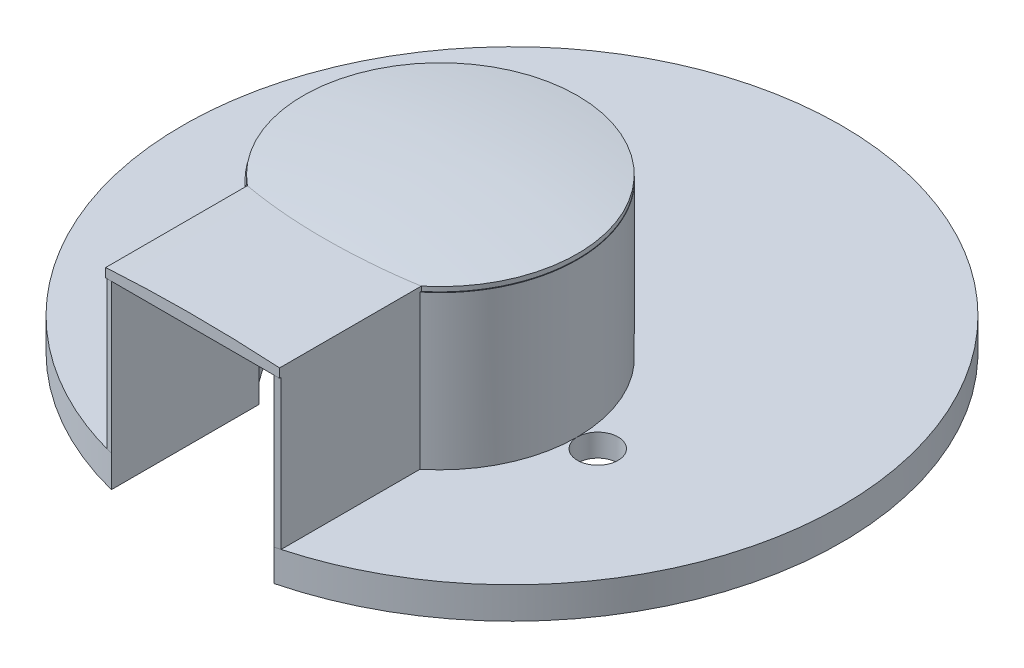
ISO-10303-21;
HEADER;
FILE_DESCRIPTION(('STEP AP214'),'2;1');
FILE_NAME('part.step','',(''),(''),'','','');
FILE_SCHEMA(('AUTOMOTIVE_DESIGN { 1 0 10303 214 1 1 1 1 }'));
ENDSEC;
DATA;
#1=APPLICATION_CONTEXT('core data for automotive mechanical design processes');
#2=APPLICATION_PROTOCOL_DEFINITION('international standard','automotive_design',2000,#1);
#3=PRODUCT_CONTEXT('',#1,'mechanical');
#4=PRODUCT('Part','Part','',(#3));
#5=PRODUCT_RELATED_PRODUCT_CATEGORY('part','',(#4));
#6=PRODUCT_DEFINITION_FORMATION('','',#4);
#7=PRODUCT_DEFINITION_CONTEXT('part definition',#1,'design');
#8=PRODUCT_DEFINITION('design','',#6,#7);
#9=PRODUCT_DEFINITION_SHAPE('','',#8);
#10=(LENGTH_UNIT() NAMED_UNIT(*) SI_UNIT(.MILLI.,.METRE.));
#11=(NAMED_UNIT(*) PLANE_ANGLE_UNIT() SI_UNIT($,.RADIAN.));
#12=(NAMED_UNIT(*) SI_UNIT($,.STERADIAN.) SOLID_ANGLE_UNIT());
#13=UNCERTAINTY_MEASURE_WITH_UNIT(LENGTH_MEASURE(1.E-05),#10,'distance_accuracy_value','');
#14=(GEOMETRIC_REPRESENTATION_CONTEXT(3) GLOBAL_UNCERTAINTY_ASSIGNED_CONTEXT((#13)) GLOBAL_UNIT_ASSIGNED_CONTEXT((#10,
#11,#12)) REPRESENTATION_CONTEXT('',''));
#15=CARTESIAN_POINT('',(0.,0.,0.));
#16=DIRECTION('',(0.,0.,1.));
#17=DIRECTION('',(1.,0.,0.));
#18=AXIS2_PLACEMENT_3D('',#15,#16,#17);
#19=CARTESIAN_POINT('',(0.,20.5,8.));
#20=DIRECTION('',(0.,-1.,0.));
#21=DIRECTION('',(0.,0.,-1.));
#22=AXIS2_PLACEMENT_3D('',#19,#20,#21);
#23=PLANE('',#22);
#24=DIRECTION('',(0.,0.,-1.));
#25=VECTOR('',#24,1.);
#26=CARTESIAN_POINT('',(9.63157894736843,20.5,8.));
#27=LINE('',#26,#25);
#28=CARTESIAN_POINT('',(9.63157894736842,20.5,19.8235014687109));
#29=VERTEX_POINT('',#28);
#30=CARTESIAN_POINT('',(9.63157894736843,20.5,19.6776855724828));
#31=VERTEX_POINT('',#30);
#32=EDGE_CURVE('E287',#29,#31,#27,.T.);
#33=ORIENTED_EDGE('',*,*,#32,.F.);
#34=CARTESIAN_POINT('',(0.,20.5,8.));
#35=DIRECTION('',(0.,1.,0.));
#36=DIRECTION('',(0.,0.,-1.));
#37=AXIS2_PLACEMENT_3D('',#34,#35,#36);
#38=CIRCLE('',#37,15.25);
#39=CARTESIAN_POINT('',(-2.33824036051226E-13,20.5,-7.25));
#40=VERTEX_POINT('',#39);
#41=EDGE_CURVE('E712',#29,#40,#38,.T.);
#42=ORIENTED_EDGE('',*,*,#41,.T.);
#43=CARTESIAN_POINT('',(0.,20.5,7.93636945437416));
#44=DIRECTION('',(0.,1.,0.));
#45=DIRECTION('',(0.,0.,1.));
#46=AXIS2_PLACEMENT_3D('',#43,#44,#45);
#47=CIRCLE('',#46,15.1863694543742);
#48=EDGE_CURVE('E407',#31,#40,#47,.T.);
#49=ORIENTED_EDGE('',*,*,#48,.F.);
#50=EDGE_LOOP('',(#33,#42,#49));
#51=FACE_BOUND('',#50,.T.);
#52=ADVANCED_FACE('F39',(#51),#23,.F.);
#53=CARTESIAN_POINT('',(9.,3.5,19.0481898969922));
#54=DIRECTION('',(1.,0.,0.));
#55=DIRECTION('',(0.,0.,-1.));
#56=AXIS2_PLACEMENT_3D('',#53,#54,#55);
#57=PLANE('',#56);
#58=DIRECTION('',(0.,0.,1.));
#59=VECTOR('',#58,1.);
#60=CARTESIAN_POINT('',(9.,19.9999999155366,19.0481898969922));
#61=LINE('',#60,#59);
#62=CARTESIAN_POINT('',(9.,19.9999999155366,19.673012311648));
#63=VERTEX_POINT('',#62);
#64=CARTESIAN_POINT('',(9.,19.9999999155366,35.373012311648));
#65=VERTEX_POINT('',#64);
#66=EDGE_CURVE('E302',#63,#65,#61,.T.);
#67=ORIENTED_EDGE('',*,*,#66,.F.);
#68=CARTESIAN_POINT('',(9.,20.2999999155366,19.673012311648));
#69=DIRECTION('',(1.,0.,0.));
#70=DIRECTION('',(0.,0.,-1.));
#71=AXIS2_PLACEMENT_3D('',#68,#69,#70);
#72=CIRCLE('',#71,0.3);
#73=CARTESIAN_POINT('',(9.,20.2999999155366,19.373012311648));
#74=VERTEX_POINT('',#73);
#75=EDGE_CURVE('E11',#63,#74,#72,.T.);
#76=ORIENTED_EDGE('',*,*,#75,.T.);
#77=DIRECTION('',(0.,-1.,0.));
#78=VECTOR('',#77,1.);
#79=CARTESIAN_POINT('',(9.,3.5,19.373012311648));
#80=LINE('',#79,#78);
#81=CARTESIAN_POINT('',(9.,20.5,19.373012311648));
#82=VERTEX_POINT('',#81);
#83=EDGE_CURVE('E283',#82,#74,#80,.T.);
#84=ORIENTED_EDGE('',*,*,#83,.F.);
#85=DIRECTION('',(0.,0.,1.));
#86=VECTOR('',#85,1.);
#87=CARTESIAN_POINT('',(9.,20.5,19.0481898969922));
#88=LINE('',#87,#86);
#89=CARTESIAN_POINT('',(9.,20.5,19.0481898969922));
#90=VERTEX_POINT('',#89);
#91=EDGE_CURVE('E700',#90,#82,#88,.T.);
#92=ORIENTED_EDGE('',*,*,#91,.F.);
#93=DIRECTION('',(0.,-1.,0.));
#94=VECTOR('',#93,1.);
#95=CARTESIAN_POINT('',(9.,3.5,19.0481898969922));
#96=LINE('',#95,#94);
#97=CARTESIAN_POINT('',(9.,0.,19.0481898969922));
#98=VERTEX_POINT('',#97);
#99=EDGE_CURVE('E580',#90,#98,#96,.T.);
#100=ORIENTED_EDGE('',*,*,#99,.T.);
#101=DIRECTION('',(0.,0.,1.));
#102=VECTOR('',#101,1.);
#103=CARTESIAN_POINT('',(9.,0.,19.0481898969922));
#104=LINE('',#103,#102);
#105=CARTESIAN_POINT('',(9.,0.,35.373012311648));
#106=VERTEX_POINT('',#105);
#107=EDGE_CURVE('E564',#98,#106,#104,.T.);
#108=ORIENTED_EDGE('',*,*,#107,.T.);
#109=DIRECTION('',(0.,-1.,0.));
#110=VECTOR('',#109,1.);
#111=CARTESIAN_POINT('',(9.,3.5,35.373012311648));
#112=LINE('',#111,#110);
#113=CARTESIAN_POINT('',(9.,3.5,35.373012311648));
#114=VERTEX_POINT('',#113);
#115=EDGE_CURVE('E518',#114,#106,#112,.T.);
#116=ORIENTED_EDGE('',*,*,#115,.F.);
#117=DIRECTION('',(0.,-1.,0.));
#118=VECTOR('',#117,1.);
#119=CARTESIAN_POINT('',(9.,20.5,35.373012311648));
#120=LINE('',#119,#118);
#121=EDGE_CURVE('E608',#65,#114,#120,.T.);
#122=ORIENTED_EDGE('',*,*,#121,.F.);
#123=EDGE_LOOP('',(#67,#76,#84,#92,#100,#108,#116,#122));
#124=FACE_BOUND('',#123,.T.);
#125=ADVANCED_FACE('F373',(#124),#57,.F.);
#126=CARTESIAN_POINT('',(-9.,3.5,19.0481898969922));
#127=DIRECTION('',(-1.,0.,0.));
#128=DIRECTION('',(0.,0.,1.));
#129=AXIS2_PLACEMENT_3D('',#126,#127,#128);
#130=PLANE('',#129);
#131=DIRECTION('',(0.,0.,-1.));
#132=VECTOR('',#131,1.);
#133=CARTESIAN_POINT('',(-9.,19.9999999155366,19.0481898969922));
#134=LINE('',#133,#132);
#135=CARTESIAN_POINT('',(-9.,19.9999999155366,35.373012311648));
#136=VERTEX_POINT('',#135);
#137=CARTESIAN_POINT('',(-9.,19.9999999155366,19.673012311648));
#138=VERTEX_POINT('',#137);
#139=EDGE_CURVE('E295',#136,#138,#134,.T.);
#140=ORIENTED_EDGE('',*,*,#139,.F.);
#141=DIRECTION('',(0.,-1.,0.));
#142=VECTOR('',#141,1.);
#143=CARTESIAN_POINT('',(-9.,20.5,35.373012311648));
#144=LINE('',#143,#142);
#145=CARTESIAN_POINT('',(-8.99999999999999,3.5,35.373012311648));
#146=VERTEX_POINT('',#145);
#147=EDGE_CURVE('E418',#136,#146,#144,.T.);
#148=ORIENTED_EDGE('',*,*,#147,.T.);
#149=DIRECTION('',(0.,-1.,0.));
#150=VECTOR('',#149,1.);
#151=CARTESIAN_POINT('',(-8.99999999999999,3.5,35.373012311648));
#152=LINE('',#151,#150);
#153=CARTESIAN_POINT('',(-8.99999999999999,0.,35.373012311648));
#154=VERTEX_POINT('',#153);
#155=EDGE_CURVE('E579',#146,#154,#152,.T.);
#156=ORIENTED_EDGE('',*,*,#155,.T.);
#157=DIRECTION('',(0.,0.,-1.));
#158=VECTOR('',#157,1.);
#159=CARTESIAN_POINT('',(-9.,0.,19.0481898969922));
#160=LINE('',#159,#158);
#161=CARTESIAN_POINT('',(-9.,0.,19.0481898969922));
#162=VERTEX_POINT('',#161);
#163=EDGE_CURVE('E572',#154,#162,#160,.T.);
#164=ORIENTED_EDGE('',*,*,#163,.T.);
#165=DIRECTION('',(0.,-1.,0.));
#166=VECTOR('',#165,1.);
#167=CARTESIAN_POINT('',(-9.,3.5,19.0481898969922));
#168=LINE('',#167,#166);
#169=CARTESIAN_POINT('',(-9.,20.5,19.0481898969922));
#170=VERTEX_POINT('',#169);
#171=EDGE_CURVE('E575',#170,#162,#168,.T.);
#172=ORIENTED_EDGE('',*,*,#171,.F.);
#173=DIRECTION('',(0.,0.,-1.));
#174=VECTOR('',#173,1.);
#175=CARTESIAN_POINT('',(-9.,20.5,35.373012311648));
#176=LINE('',#175,#174);
#177=CARTESIAN_POINT('',(-9.,20.5,19.373012311648));
#178=VERTEX_POINT('',#177);
#179=EDGE_CURVE('E422',#178,#170,#176,.T.);
#180=ORIENTED_EDGE('',*,*,#179,.F.);
#181=DIRECTION('',(0.,1.,0.));
#182=VECTOR('',#181,1.);
#183=CARTESIAN_POINT('',(-9.,3.5,19.373012311648));
#184=LINE('',#183,#182);
#185=CARTESIAN_POINT('',(-9.,20.2999999155366,19.373012311648));
#186=VERTEX_POINT('',#185);
#187=EDGE_CURVE('E280',#186,#178,#184,.T.);
#188=ORIENTED_EDGE('',*,*,#187,.F.);
#189=CARTESIAN_POINT('',(-9.,20.2999999155366,19.673012311648));
#190=DIRECTION('',(-1.,0.,0.));
#191=DIRECTION('',(0.,0.,1.));
#192=AXIS2_PLACEMENT_3D('',#189,#190,#191);
#193=CIRCLE('',#192,0.3);
#194=EDGE_CURVE('E48',#186,#138,#193,.T.);
#195=ORIENTED_EDGE('',*,*,#194,.T.);
#196=EDGE_LOOP('',(#140,#148,#156,#164,#172,#180,#188,#195));
#197=FACE_BOUND('',#196,.T.);
#198=ADVANCED_FACE('F380',(#197),#130,.F.);
#199=CARTESIAN_POINT('',(9.63157894736843,20.5,35.2062876057759));
#200=DIRECTION('',(-0.255237327404758,0.,-0.966878434292169));
#201=DIRECTION('',(-0.966878434292169,0.,0.255237327404758));
#202=AXIS2_PLACEMENT_3D('',#199,#200,#201);
#203=PLANE('',#202);
#204=DIRECTION('',(0.966878434292169,0.,-0.255237327404758));
#205=VECTOR('',#204,1.);
#206=CARTESIAN_POINT('',(9.63157894736843,19.9999999155366,35.2062876057759));
#207=LINE('',#206,#205);
#208=CARTESIAN_POINT('',(9.63157894736843,19.9999999155366,35.2062876057759));
#209=VERTEX_POINT('',#208);
#210=EDGE_CURVE('E298',#65,#209,#207,.T.);
#211=ORIENTED_EDGE('',*,*,#210,.F.);
#212=ORIENTED_EDGE('',*,*,#121,.T.);
#213=CARTESIAN_POINT('',(9.,3.5,35.373012311648));
#214=DIRECTION('',(0.966878434292169,0.,-0.255237327404758));
#215=VECTOR('',#214,1.);
#216=LINE('',#213,#215);
#217=CARTESIAN_POINT('',(9.63157892148078,3.5,35.2063070725332));
#218=VERTEX_POINT('',#217);
#219=EDGE_CURVE('E432',#114,#218,#216,.T.);
#220=ORIENTED_EDGE('',*,*,#219,.T.);
#221=DIRECTION('',(0.,-1.,0.));
#222=VECTOR('',#221,1.);
#223=CARTESIAN_POINT('',(9.63157894736843,20.5,35.2062876057759));
#224=LINE('',#223,#222);
#225=EDGE_CURVE('E730',#209,#218,#224,.T.);
#226=ORIENTED_EDGE('',*,*,#225,.F.);
#227=EDGE_LOOP('',(#211,#212,#220,#226));
#228=FACE_BOUND('',#227,.T.);
#229=ADVANCED_FACE('F393',(#228),#203,.F.);
#230=CARTESIAN_POINT('',(-9.63157894736842,20.5,35.2062876057759));
#231=DIRECTION('',(0.25523732740476,0.,-0.966878434292169));
#232=DIRECTION('',(-0.966878434292169,0.,-0.25523732740476));
#233=AXIS2_PLACEMENT_3D('',#230,#231,#232);
#234=PLANE('',#233);
#235=DIRECTION('',(0.966878434292169,0.,0.25523732740476));
#236=VECTOR('',#235,1.);
#237=CARTESIAN_POINT('',(-9.63157894736842,19.9999999155366,35.2062876057759));
#238=LINE('',#237,#236);
#239=CARTESIAN_POINT('',(-9.63157894736842,19.9999999155366,35.2062876057759));
#240=VERTEX_POINT('',#239);
#241=EDGE_CURVE('E225',#240,#136,#238,.T.);
#242=ORIENTED_EDGE('',*,*,#241,.F.);
#243=DIRECTION('',(0.,-1.,0.));
#244=VECTOR('',#243,1.);
#245=CARTESIAN_POINT('',(-9.63157894736842,20.5,35.2062876057759));
#246=LINE('',#245,#244);
#247=CARTESIAN_POINT('',(-9.63157892144228,3.5,35.2063083142909));
#248=VERTEX_POINT('',#247);
#249=EDGE_CURVE('E242',#240,#248,#246,.T.);
#250=ORIENTED_EDGE('',*,*,#249,.T.);
#251=CARTESIAN_POINT('',(-9.63157894736842,3.5,35.2062876057759));
#252=DIRECTION('',(0.966878434292169,0.,0.25523732740476));
#253=VECTOR('',#252,1.);
#254=LINE('',#251,#253);
#255=EDGE_CURVE('E706',#248,#146,#254,.T.);
#256=ORIENTED_EDGE('',*,*,#255,.T.);
#257=ORIENTED_EDGE('',*,*,#147,.F.);
#258=EDGE_LOOP('',(#242,#250,#256,#257));
#259=FACE_BOUND('',#258,.T.);
#260=ADVANCED_FACE('F386',(#259),#234,.F.);
#261=DIRECTION('',(0.,0.,1.));
#262=VECTOR('',#261,1.);
#263=CARTESIAN_POINT('',(-9.63157894736843,20.5,8.));
#264=LINE('',#263,#262);
#265=CARTESIAN_POINT('',(-9.63157894736843,20.5,19.6776855724828));
#266=VERTEX_POINT('',#265);
#267=CARTESIAN_POINT('',(-9.63157894736842,20.5,19.8235014687109));
#268=VERTEX_POINT('',#267);
#269=EDGE_CURVE('E291',#266,#268,#264,.T.);
#270=ORIENTED_EDGE('',*,*,#269,.F.);
#271=EDGE_CURVE('E397',#40,#266,#47,.T.);
#272=ORIENTED_EDGE('',*,*,#271,.F.);
#273=EDGE_CURVE('E399',#40,#268,#38,.T.);
#274=ORIENTED_EDGE('',*,*,#273,.T.);
#275=EDGE_LOOP('',(#270,#272,#274));
#276=FACE_BOUND('',#275,.T.);
#277=ADVANCED_FACE('F376',(#276),#23,.F.);
#278=CARTESIAN_POINT('',(0.,20.5,-5.75));
#279=DIRECTION('',(0.,1.,0.));
#280=DIRECTION('',(0.,0.,1.));
#281=AXIS2_PLACEMENT_3D('',#278,#279,#280);
#282=PLANE('',#281);
#283=DIRECTION('',(1.,0.,0.));
#284=VECTOR('',#283,1.);
#285=CARTESIAN_POINT('',(0.,20.5,19.373012311648));
#286=LINE('',#285,#284);
#287=CARTESIAN_POINT('',(-7.51797239931047,20.5,19.373012311648));
#288=VERTEX_POINT('',#287);
#289=EDGE_CURVE('E279',#178,#288,#286,.T.);
#290=ORIENTED_EDGE('',*,*,#289,.F.);
#291=ORIENTED_EDGE('',*,*,#179,.T.);
#292=CARTESIAN_POINT('',(0.,20.5,8.));
#293=DIRECTION('',(0.,-1.,0.));
#294=DIRECTION('',(0.,0.,-1.));
#295=AXIS2_PLACEMENT_3D('',#292,#293,#294);
#296=CIRCLE('',#295,14.25);
#297=EDGE_CURVE('E698',#170,#90,#296,.T.);
#298=ORIENTED_EDGE('',*,*,#297,.T.);
#299=ORIENTED_EDGE('',*,*,#91,.T.);
#300=CARTESIAN_POINT('',(7.51797239931047,20.5,19.373012311648));
#301=VERTEX_POINT('',#300);
#302=EDGE_CURVE('E244',#301,#82,#286,.T.);
#303=ORIENTED_EDGE('',*,*,#302,.F.);
#304=CARTESIAN_POINT('',(0.,20.5,7.93636945437416));
#305=DIRECTION('',(0.,1.,0.));
#306=DIRECTION('',(0.,0.,1.));
#307=AXIS2_PLACEMENT_3D('',#304,#305,#306);
#308=CIRCLE('',#307,13.6863694543742);
#309=EDGE_CURVE('E305',#301,#288,#308,.T.);
#310=ORIENTED_EDGE('',*,*,#309,.T.);
#311=EDGE_LOOP('',(#290,#291,#298,#299,#303,#310));
#312=FACE_BOUND('',#311,.T.);
#313=ADVANCED_FACE('F385',(#312),#282,.F.);
#314=CARTESIAN_POINT('',(0.,22.1,7.93636945437416));
#315=DIRECTION('',(0.,1.,0.));
#316=DIRECTION('',(0.,0.,1.));
#317=AXIS2_PLACEMENT_3D('',#314,#315,#316);
#318=CYLINDRICAL_SURFACE('',#317,15.1863694543742);
#319=DIRECTION('',(0.,1.,0.));
#320=VECTOR('',#319,1.);
#321=CARTESIAN_POINT('',(-9.63157894736843,22.1,19.6776855724828));
#322=LINE('',#321,#320);
#323=CARTESIAN_POINT('',(-9.63157933387925,21.,19.6776852554221));
#324=VERTEX_POINT('',#323);
#325=EDGE_CURVE('E404',#324,#266,#322,.F.);
#326=ORIENTED_EDGE('',*,*,#325,.F.);
#327=CARTESIAN_POINT('',(0.,21.,7.93636945437416));
#328=DIRECTION('',(0.,1.,0.));
#329=DIRECTION('',(0.,0.,1.));
#330=AXIS2_PLACEMENT_3D('',#327,#328,#329);
#331=CIRCLE('',#330,15.1863694543742);
#332=CARTESIAN_POINT('',(9.63157759150874,21.,19.6776866847149));
#333=VERTEX_POINT('',#332);
#334=EDGE_CURVE('E756',#333,#324,#331,.T.);
#335=ORIENTED_EDGE('',*,*,#334,.F.);
#336=DIRECTION('',(0.,1.,0.));
#337=VECTOR('',#336,1.);
#338=CARTESIAN_POINT('',(9.63157894736843,22.1,19.6776855724828));
#339=LINE('',#338,#337);
#340=EDGE_CURVE('E340',#31,#333,#339,.T.);
#341=ORIENTED_EDGE('',*,*,#340,.F.);
#342=ORIENTED_EDGE('',*,*,#48,.T.);
#343=ORIENTED_EDGE('',*,*,#271,.T.);
#344=EDGE_LOOP('',(#326,#335,#341,#342,#343));
#345=FACE_BOUND('',#344,.T.);
#346=ADVANCED_FACE('F324',(#345),#318,.T.);
#347=CARTESIAN_POINT('',(0.,21.,-7.25));
#348=CARTESIAN_POINT('',(0.,22.0473961274008,0.307195453859962));
#349=CARTESIAN_POINT('',(0.,22.1,7.93636945437416));
#350=B_SPLINE_CURVE_WITH_KNOTS('',2,(#347,#348,#349),.UNSPECIFIED.,.F.,.F.,(3,3),(0.,1.),.UNSPECIFIED.);
#351=CARTESIAN_POINT('',(0.,22.1,7.93636945437416));
#352=DIRECTION('',(0.,1.,0.));
#353=AXIS1_PLACEMENT('',#351,#352);
#354=SURFACE_OF_REVOLUTION('',#350,#353);
#355=CARTESIAN_POINT('',(0.,22.1,7.93636945437416));
#356=VERTEX_POINT('',#355);
#357=VERTEX_LOOP('',#356);
#358=FACE_BOUND('',#357,.T.);
#359=CARTESIAN_POINT('',(9.63157759150874,21.,19.6776866847149));
#360=CARTESIAN_POINT('',(9.27344960705985,21.0223106925979,19.7632542832872));
#361=CARTESIAN_POINT('',(8.91402306394495,21.0434556213014,19.8435664016353));
#362=CARTESIAN_POINT('',(8.19273879852531,21.0833581775395,19.9939776243259));
#363=CARTESIAN_POINT('',(7.83088006598716,21.1021147390688,20.0640721702429));
#364=CARTESIAN_POINT('',(6.73771260189378,21.1549155363178,20.2602080076721));
#365=CARTESIAN_POINT('',(6.00343446265745,21.1852015802909,20.3710050981187));
#366=CARTESIAN_POINT('',(4.52954550173994,21.2354079747097,20.553458280065));
#367=CARTESIAN_POINT('',(3.7899332979209,21.2553255329535,20.625103828431));
#368=CARTESIAN_POINT('',(2.30700682515177,21.2845679423428,20.7299852102351));
#369=CARTESIAN_POINT('',(1.56368948465843,21.2938816501898,20.7631806381205));
#370=CARTESIAN_POINT('',(0.076304546111601,21.3017692538154,20.7913084581849));
#371=CARTESIAN_POINT('',(-0.667762991326655,21.3003439570803,20.7862437272184));
#372=CARTESIAN_POINT('',(-1.87296654457538,21.2893457861479,20.7469842886641));
#373=CARTESIAN_POINT('',(-2.33455014743468,21.2830624484648,20.724546175457));
#374=CARTESIAN_POINT('',(-3.25668342743961,21.2663885640686,20.6648041070752));
#375=CARTESIAN_POINT('',(-3.717233126135,21.2559981037752,20.6275004646921));
#376=CARTESIAN_POINT('',(-4.63673506965388,21.2311569372631,20.5378942183939));
#377=CARTESIAN_POINT('',(-5.09568740088779,21.2167064542413,20.4855924389879));
#378=CARTESIAN_POINT('',(-6.01076464687488,21.1838375915503,20.3658623621259));
#379=CARTESIAN_POINT('',(-6.46689279993188,21.1654252792563,20.2984571884292));
#380=CARTESIAN_POINT('',(-7.37644642863493,21.1247058505377,20.1481690826863));
#381=CARTESIAN_POINT('',(-7.82987178141173,21.102398558423,20.0652854524441));
#382=CARTESIAN_POINT('',(-8.73340803592613,21.054004176548,19.8835649395086));
#383=CARTESIAN_POINT('',(-9.18351821454948,21.0279162863958,19.7847246781245));
#384=CARTESIAN_POINT('',(-9.63157894736843,21.0000000844634,19.6776847842486));
#385=B_SPLINE_CURVE_WITH_KNOTS('',3,(#359,#360,#361,#362,#363,#364,#365,#366,#367,#368,#369,
#370,#371,#372,#373,#374,#375,#376,#377,#378,#379,#380,#381,#382,#383,#384),.UNSPECIFIED.,.F.,
.F.,(4,2,2,2,2,2,2,2,2,2,2,2,4),(0.,1.10655730957774,2.21360679298627,4.44196109673573,
6.67091517952816,8.90220945385566,11.1333359545666,12.5196214475661,13.9058777727162,
15.2920579042998,16.6761300795612,18.0602647020671,19.4446927894868),.UNSPECIFIED.);
#386=EDGE_CURVE('E330',#333,#324,#385,.T.);
#387=ORIENTED_EDGE('',*,*,#386,.F.);
#388=ORIENTED_EDGE('',*,*,#334,.T.);
#389=EDGE_LOOP('',(#387,#388));
#390=FACE_BOUND('',#389,.T.);
#391=ADVANCED_FACE('F318',(#358,#390),#354,.T.);
#392=CARTESIAN_POINT('',(0.,21.1,7.93636945437416));
#393=CARTESIAN_POINT('',(0.,20.9674223600963,1.08562125942859));
#394=CARTESIAN_POINT('',(0.,20.5,-5.75));
#395=B_SPLINE_CURVE_WITH_KNOTS('',2,(#392,#393,#394),.UNSPECIFIED.,.F.,.F.,(3,3),(0.,1.),.UNSPECIFIED.);
#396=CARTESIAN_POINT('',(0.,22.1,7.93636945437416));
#397=DIRECTION('',(0.,1.,0.));
#398=AXIS1_PLACEMENT('',#396,#397);
#399=SURFACE_OF_REVOLUTION('',#395,#398);
#400=CARTESIAN_POINT('',(0.,21.1,7.93636945437416));
#401=VERTEX_POINT('',#400);
#402=VERTEX_LOOP('',#401);
#403=FACE_BOUND('',#402,.T.);
#404=CARTESIAN_POINT('',(-7.51797239931047,20.5,19.373012311648));
#405=CARTESIAN_POINT('',(-7.06152326678267,20.5171435586207,19.373012311648));
#406=CARTESIAN_POINT('',(-6.6050214600238,20.5328624620459,19.373012311648));
#407=CARTESIAN_POINT('',(-5.69189659257654,20.5613396151681,19.373012311648));
#408=CARTESIAN_POINT('',(-5.23527352602602,20.5740976766483,19.373012311648));
#409=CARTESIAN_POINT('',(-3.86486043173128,20.6077710016688,19.373012311648));
#410=CARTESIAN_POINT('',(-2.95095154627894,20.6240692323794,19.373012311648));
#411=CARTESIAN_POINT('',(-1.12298212946405,20.6435986360304,19.373012311648));
#412=CARTESIAN_POINT('',(-0.208921596265791,20.6468296371773,19.373012311648));
#413=CARTESIAN_POINT('',(1.61913570457079,20.6400397610865,19.373012311648));
#414=CARTESIAN_POINT('',(2.53313247293999,20.6300190754496,19.373012311648));
#415=CARTESIAN_POINT('',(4.36088550040464,20.5972588371446,19.373012311648));
#416=CARTESIAN_POINT('',(5.27464176271541,20.5745194641606,19.373012311648));
#417=CARTESIAN_POINT('',(6.40985803381559,20.538903779446,19.373012311648));
#418=CARTESIAN_POINT('',(6.631502061274,20.5316010430336,19.373012311648));
#419=CARTESIAN_POINT('',(7.0747588942984,20.5163109362466,19.373012311648));
#420=CARTESIAN_POINT('',(7.29637170067461,20.5083235893663,19.373012311648));
#421=CARTESIAN_POINT('',(7.51797239931047,20.5,19.373012311648));
#422=B_SPLINE_CURVE_WITH_KNOTS('',3,(#404,#405,#406,#407,#408,#409,#410,#411,#412,#413,#414,
#415,#416,#417,#418,#419,#420,#421),.UNSPECIFIED.,.F.,.F.,(4,2,2,2,2,2,2,2,4),(0.,
1.37030858164689,2.74070424817158,5.48277151388823,8.22487482912706,10.9669384978314,
13.7089634288557,14.3742558271635,15.0395254034363),.UNSPECIFIED.);
#423=EDGE_CURVE('E341',#288,#301,#422,.T.);
#424=ORIENTED_EDGE('',*,*,#423,.F.);
#425=ORIENTED_EDGE('',*,*,#309,.F.);
#426=EDGE_LOOP('',(#424,#425));
#427=FACE_BOUND('',#426,.T.);
#428=ADVANCED_FACE('F323',(#403,#427),#399,.T.);
#429=CARTESIAN_POINT('',(0.,3.5,8.));
#430=DIRECTION('',(0.,-1.,0.));
#431=DIRECTION('',(0.,0.,-1.));
#432=AXIS2_PLACEMENT_3D('',#429,#430,#431);
#433=CYLINDRICAL_SURFACE('',#432,14.25);
#434=DIRECTION('',(0.,-1.,0.));
#435=VECTOR('',#434,1.);
#436=CARTESIAN_POINT('',(-13.7477270848675,3.5,4.25));
#437=LINE('',#436,#435);
#438=CARTESIAN_POINT('',(-13.7477270848675,0.,4.25));
#439=VERTEX_POINT('',#438);
#440=CARTESIAN_POINT('',(-13.7477270848675,1.,4.25));
#441=VERTEX_POINT('',#440);
#442=EDGE_CURVE('E541',#439,#441,#437,.F.);
#443=ORIENTED_EDGE('',*,*,#442,.F.);
#444=CARTESIAN_POINT('',(0.,0.,8.));
#445=DIRECTION('',(0.,-1.,0.));
#446=DIRECTION('',(0.,0.,1.));
#447=AXIS2_PLACEMENT_3D('',#444,#445,#446);
#448=CIRCLE('',#447,14.25);
#449=CARTESIAN_POINT('',(13.7477270848675,0.,4.25));
#450=VERTEX_POINT('',#449);
#451=EDGE_CURVE('E544',#439,#450,#448,.T.);
#452=ORIENTED_EDGE('',*,*,#451,.T.);
#453=DIRECTION('',(0.,-1.,0.));
#454=VECTOR('',#453,1.);
#455=CARTESIAN_POINT('',(13.7477270848675,3.5,4.25));
#456=LINE('',#455,#454);
#457=CARTESIAN_POINT('',(13.7477270848675,1.,4.25));
#458=VERTEX_POINT('',#457);
#459=EDGE_CURVE('E550',#458,#450,#456,.T.);
#460=ORIENTED_EDGE('',*,*,#459,.F.);
#461=CARTESIAN_POINT('',(0.,1.,8.));
#462=DIRECTION('',(0.,1.,0.));
#463=DIRECTION('',(0.,0.,1.));
#464=AXIS2_PLACEMENT_3D('',#461,#462,#463);
#465=CIRCLE('',#464,14.25);
#466=CARTESIAN_POINT('',(13.7477270848675,1.,11.75));
#467=VERTEX_POINT('',#466);
#468=EDGE_CURVE('E587',#458,#467,#465,.F.);
#469=ORIENTED_EDGE('',*,*,#468,.T.);
#470=DIRECTION('',(0.,-1.,0.));
#471=VECTOR('',#470,1.);
#472=CARTESIAN_POINT('',(13.7477270848675,3.5,11.75));
#473=LINE('',#472,#471);
#474=CARTESIAN_POINT('',(13.7477270848675,0.,11.75));
#475=VERTEX_POINT('',#474);
#476=EDGE_CURVE('E657',#475,#467,#473,.F.);
#477=ORIENTED_EDGE('',*,*,#476,.F.);
#478=EDGE_CURVE('E549',#475,#98,#448,.T.);
#479=ORIENTED_EDGE('',*,*,#478,.T.);
#480=ORIENTED_EDGE('',*,*,#99,.F.);
#481=ORIENTED_EDGE('',*,*,#297,.F.);
#482=ORIENTED_EDGE('',*,*,#171,.T.);
#483=CARTESIAN_POINT('',(-13.7477270848675,0.,11.75));
#484=VERTEX_POINT('',#483);
#485=EDGE_CURVE('E559',#162,#484,#448,.T.);
#486=ORIENTED_EDGE('',*,*,#485,.T.);
#487=DIRECTION('',(0.,-1.,0.));
#488=VECTOR('',#487,1.);
#489=CARTESIAN_POINT('',(-13.7477270848675,3.5,11.75));
#490=LINE('',#489,#488);
#491=CARTESIAN_POINT('',(-13.7477270848675,1.,11.75));
#492=VERTEX_POINT('',#491);
#493=EDGE_CURVE('E654',#492,#484,#490,.T.);
#494=ORIENTED_EDGE('',*,*,#493,.F.);
#495=EDGE_CURVE('E546',#492,#441,#465,.F.);
#496=ORIENTED_EDGE('',*,*,#495,.T.);
#497=EDGE_LOOP('',(#443,#452,#460,#469,#477,#479,#480,#481,#482,#486,#494,#496));
#498=FACE_BOUND('',#497,.T.);
#499=ADVANCED_FACE('F529',(#498),#433,.F.);
#500=CARTESIAN_POINT('',(0.,0.,8.));
#501=DIRECTION('',(0.,1.,0.));
#502=DIRECTION('',(0.,0.,1.));
#503=AXIS2_PLACEMENT_3D('',#500,#501,#502);
#504=PLANE('',#503);
#505=DIRECTION('',(-1.,0.,0.));
#506=VECTOR('',#505,1.);
#507=CARTESIAN_POINT('',(-17.5,0.,4.25));
#508=LINE('',#507,#506);
#509=CARTESIAN_POINT('',(17.5,0.,4.25));
#510=VERTEX_POINT('',#509);
#511=EDGE_CURVE('E557',#510,#450,#508,.T.);
#512=ORIENTED_EDGE('',*,*,#511,.T.);
#513=ORIENTED_EDGE('',*,*,#451,.F.);
#514=DIRECTION('',(1.,0.,0.));
#515=VECTOR('',#514,1.);
#516=CARTESIAN_POINT('',(0.,0.,4.25));
#517=LINE('',#516,#515);
#518=CARTESIAN_POINT('',(-17.5,0.,4.25));
#519=VERTEX_POINT('',#518);
#520=EDGE_CURVE('E555',#519,#439,#517,.T.);
#521=ORIENTED_EDGE('',*,*,#520,.F.);
#522=CARTESIAN_POINT('',(-17.5,0.,8.));
#523=DIRECTION('',(0.,1.,0.));
#524=DIRECTION('',(0.,0.,1.));
#525=AXIS2_PLACEMENT_3D('',#522,#523,#524);
#526=CIRCLE('',#525,3.75);
#527=CARTESIAN_POINT('',(-17.5,0.,11.75));
#528=VERTEX_POINT('',#527);
#529=EDGE_CURVE('E635',#519,#528,#526,.T.);
#530=ORIENTED_EDGE('',*,*,#529,.T.);
#531=DIRECTION('',(1.,0.,0.));
#532=VECTOR('',#531,1.);
#533=CARTESIAN_POINT('',(-17.5,0.,11.75));
#534=LINE('',#533,#532);
#535=EDGE_CURVE('E617',#528,#484,#534,.T.);
#536=ORIENTED_EDGE('',*,*,#535,.T.);
#537=ORIENTED_EDGE('',*,*,#485,.F.);
#538=ORIENTED_EDGE('',*,*,#163,.F.);
#539=CARTESIAN_POINT('',(0.,0.,0.));
#540=DIRECTION('',(0.,1.,0.));
#541=DIRECTION('',(0.,0.,1.));
#542=AXIS2_PLACEMENT_3D('',#539,#540,#541);
#543=CIRCLE('',#542,36.5);
#544=EDGE_CURVE('E569',#106,#154,#543,.T.);
#545=ORIENTED_EDGE('',*,*,#544,.F.);
#546=ORIENTED_EDGE('',*,*,#107,.F.);
#547=ORIENTED_EDGE('',*,*,#478,.F.);
#548=DIRECTION('',(-1.,0.,0.));
#549=VECTOR('',#548,1.);
#550=CARTESIAN_POINT('',(0.,0.,11.75));
#551=LINE('',#550,#549);
#552=CARTESIAN_POINT('',(17.5,0.,11.75));
#553=VERTEX_POINT('',#552);
#554=EDGE_CURVE('E584',#553,#475,#551,.T.);
#555=ORIENTED_EDGE('',*,*,#554,.F.);
#556=CARTESIAN_POINT('',(17.5,0.,8.));
#557=DIRECTION('',(0.,1.,0.));
#558=DIRECTION('',(0.,0.,1.));
#559=AXIS2_PLACEMENT_3D('',#556,#557,#558);
#560=CIRCLE('',#559,3.75);
#561=EDGE_CURVE('E600',#553,#510,#560,.T.);
#562=ORIENTED_EDGE('',*,*,#561,.T.);
#563=EDGE_LOOP('',(#512,#513,#521,#530,#536,#537,#538,#545,#546,#547,#555,#562));
#564=FACE_BOUND('',#563,.T.);
#565=ADVANCED_FACE('F487',(#564),#504,.F.);
#566=CARTESIAN_POINT('',(0.,3.5,0.));
#567=DIRECTION('',(0.,-1.,0.));
#568=DIRECTION('',(0.,0.,-1.));
#569=AXIS2_PLACEMENT_3D('',#566,#567,#568);
#570=CYLINDRICAL_SURFACE('',#569,36.5);
#571=ORIENTED_EDGE('',*,*,#544,.T.);
#572=ORIENTED_EDGE('',*,*,#155,.F.);
#573=ORIENTED_EDGE('',*,*,#255,.F.);
#574=CARTESIAN_POINT('',(9.,3.5,35.373012311648));
#575=CARTESIAN_POINT('',(12.2057006307264,3.5,34.5573818693676));
#576=CARTESIAN_POINT('',(15.2132254639266,3.5,33.1784232745279));
#577=CARTESIAN_POINT('',(18.2197304259665,3.5,31.7999322934836));
#578=CARTESIAN_POINT('',(20.930624912633,3.5,29.902490544546));
#579=CARTESIAN_POINT('',(23.6402905123002,3.5,28.0059089329207));
#580=CARTESIAN_POINT('',(25.9658581520034,3.5,25.6519825828344));
#581=CARTESIAN_POINT('',(28.2903715787991,3.5,23.2991233010627));
#582=CARTESIAN_POINT('',(30.1548179952546,3.5,20.5654309868057));
#583=CARTESIAN_POINT('',(32.0184192315602,3.5,17.8329778942608));
#584=CARTESIAN_POINT('',(33.3609788073779,3.5,14.8086154995558));
#585=CARTESIAN_POINT('',(34.7029297817809,3.5,11.7856240914834));
#586=CARTESIAN_POINT('',(35.4798461178612,3.5,8.56916095384436));
#587=CARTESIAN_POINT('',(36.2564102666929,3.5,5.35415588479));
#588=CARTESIAN_POINT('',(36.4423622809194,3.5,2.05042224583606));
#589=CARTESIAN_POINT('',(36.6282300004501,3.5,-1.25181376361677));
#590=CARTESIAN_POINT('',(36.2171571867199,3.5,-4.53514336183811));
#591=CARTESIAN_POINT('',(35.8062707181633,3.5,-7.81698457989023));
#592=CARTESIAN_POINT('',(34.8115706689308,3.5,-10.9729005992962));
#593=CARTESIAN_POINT('',(33.8173215314522,3.5,-14.1273859968496));
#594=CARTESIAN_POINT('',(32.2714132865173,3.5,-17.0530315337419));
#595=CARTESIAN_POINT('',(30.7262058238526,3.5,-19.9773508337582));
#596=CARTESIAN_POINT('',(28.6794732763288,3.5,-22.577373908237));
#597=CARTESIAN_POINT('',(26.633668541888,3.5,-25.1762183551382));
#598=CARTESIAN_POINT('',(24.1528183375451,3.5,-27.3658796013127));
#599=CARTESIAN_POINT('',(21.6730927380758,3.5,-29.5545482427324));
#600=CARTESIAN_POINT('',(18.8389801876113,3.5,-31.2624827147619));
#601=CARTESIAN_POINT('',(16.0061523808738,3.5,-32.9696429556839));
#602=CARTESIAN_POINT('',(12.9111462417572,3.5,-34.1401860382154));
#603=CARTESIAN_POINT('',(9.817543113105,3.5,-35.310198496858));
#604=CARTESIAN_POINT('',(6.56251512779734,3.5,-35.9052001135968));
#605=CARTESIAN_POINT('',(3.30896269306317,3.5,-36.4999320076232));
#606=CARTESIAN_POINT('',(0.,3.5,-36.5));
#607=CARTESIAN_POINT('',(-3.30746269317631,3.5,-36.5000679615548));
#608=CARTESIAN_POINT('',(-6.56251512779734,3.5,-35.9052001135968));
#609=CARTESIAN_POINT('',(-9.8160920007881,3.5,-35.3106019277069));
#610=CARTESIAN_POINT('',(-12.9111462417572,3.5,-34.1401860382154));
#611=CARTESIAN_POINT('',(-16.004797450531,3.5,-32.9703007149263));
#612=CARTESIAN_POINT('',(-18.8389801876113,3.5,-31.262482714762));
#613=CARTESIAN_POINT('',(-21.6718781493616,3.5,-29.5554388927781));
#614=CARTESIAN_POINT('',(-24.1528183375451,3.5,-27.3658796013127));
#615=CARTESIAN_POINT('',(-26.6326338803274,3.5,-25.1773128681523));
#616=CARTESIAN_POINT('',(-28.6794732763288,3.5,-22.577373908237));
#617=CARTESIAN_POINT('',(-30.7253848108922,3.5,-19.9786135376662));
#618=CARTESIAN_POINT('',(-32.2714132865173,3.5,-17.0530315337419));
#619=CARTESIAN_POINT('',(-33.8167409253762,3.5,-14.128775737881));
#620=CARTESIAN_POINT('',(-34.8115706689308,3.5,-10.9729005992962));
#621=CARTESIAN_POINT('',(-35.8059494419854,3.5,-7.81845606388584));
#622=CARTESIAN_POINT('',(-36.2171571867199,3.5,-4.53514336183809));
#623=CARTESIAN_POINT('',(-36.6281785251221,3.5,-1.25331903223992));
#624=CARTESIAN_POINT('',(-36.4423622809194,3.5,2.05042224583608));
#625=CARTESIAN_POINT('',(-36.2566302698746,3.5,5.35266589079725));
#626=CARTESIAN_POINT('',(-35.4798461178612,3.5,8.56916095384437));
#627=CARTESIAN_POINT('',(-34.7034140932107,3.5,11.7841979336883));
#628=CARTESIAN_POINT('',(-33.3609788073779,3.5,14.8086154995558));
#629=CARTESIAN_POINT('',(-32.0191520666496,3.5,17.831662053708));
#630=CARTESIAN_POINT('',(-30.1548179952546,3.5,20.5654309868057));
#631=CARTESIAN_POINT('',(-28.2913290531758,3.5,23.2979606633213));
#632=CARTESIAN_POINT('',(-25.9658581520034,3.5,25.6519825828344));
#633=CARTESIAN_POINT('',(-23.6414414200848,3.5,28.0049373905082));
#634=CARTESIAN_POINT('',(-20.930624912633,3.5,29.9024905445461));
#635=CARTESIAN_POINT('',(-18.221037257022,3.5,31.7991835106368));
#636=CARTESIAN_POINT('',(-15.2132254639266,3.5,33.1784232745279));
#637=CARTESIAN_POINT('',(-12.2064334443343,3.5,34.5571954186799));
#638=CARTESIAN_POINT('',(-8.99999999999999,3.5,35.373012311648));
#639=B_SPLINE_CURVE_WITH_KNOTS('',2,(#574,#575,#576,#577,#578,#579,#580,#581,#582,#583,#584,
#585,#586,#587,#588,#589,#590,#591,#592,#593,#594,#595,#596,#597,#598,#599,#600,#601,#602,#603,
#604,#605,#606,#607,#608,#609,#610,#611,#612,#613,#614,#615,#616,#617,#618,#619,#620,#621,#622,
#623,#624,#625,#626,#627,#628,#629,#630,#631,#632,#633,#634,#635,#636,#637,#638),.UNSPECIFIED.,
.F.,.F.,(3,2,2,2,2,2,2,2,2,2,2,2,2,2,2,2,2,2,2,2,2,2,2,2,2,2,2,2,2,2,2,2,3),(0.,0.03125,0.0625,
0.09375,0.125,0.15625,0.1875,0.21875,0.25,0.28125,0.3125,0.34375,0.375,0.40625,0.4375,0.46875,
0.5,0.53125,0.5625,0.59375,0.625,0.65625,0.6875,0.71875,0.75,0.78125,0.8125,0.84375,0.875,
0.90625,0.9375,0.96875,1.),.UNSPECIFIED.);
#640=EDGE_CURVE('E509',#218,#248,#639,.T.);
#641=ORIENTED_EDGE('',*,*,#640,.F.);
#642=ORIENTED_EDGE('',*,*,#219,.F.);
#643=ORIENTED_EDGE('',*,*,#115,.T.);
#644=EDGE_LOOP('',(#571,#572,#573,#641,#642,#643));
#645=FACE_BOUND('',#644,.T.);
#646=ADVANCED_FACE('F485',(#645),#570,.T.);
#647=CARTESIAN_POINT('',(0.,3.5,8.));
#648=DIRECTION('',(0.,1.,0.));
#649=DIRECTION('',(0.,0.,1.));
#650=AXIS2_PLACEMENT_3D('',#647,#648,#649);
#651=PLANE('',#650);
#652=DIRECTION('',(0.,0.,1.));
#653=VECTOR('',#652,1.);
#654=CARTESIAN_POINT('',(-9.63157894736842,3.5,19.8235014687109));
#655=LINE('',#654,#653);
#656=CARTESIAN_POINT('',(-9.63157894736842,3.5,19.8235014687109));
#657=VERTEX_POINT('',#656);
#658=EDGE_CURVE('E709',#657,#248,#655,.T.);
#659=ORIENTED_EDGE('',*,*,#658,.F.);
#660=CARTESIAN_POINT('',(0.,3.5,8.));
#661=DIRECTION('',(0.,1.,0.));
#662=DIRECTION('',(0.,0.,-1.));
#663=AXIS2_PLACEMENT_3D('',#660,#661,#662);
#664=CIRCLE('',#663,15.25);
#665=CARTESIAN_POINT('',(-15.25,3.5,8.));
#666=VERTEX_POINT('',#665);
#667=EDGE_CURVE('E409',#666,#657,#664,.T.);
#668=ORIENTED_EDGE('',*,*,#667,.F.);
#669=CARTESIAN_POINT('',(-17.5,3.5,8.));
#670=DIRECTION('',(0.,1.,0.));
#671=DIRECTION('',(0.,0.,1.));
#672=AXIS2_PLACEMENT_3D('',#669,#670,#671);
#673=CIRCLE('',#672,2.25);
#674=EDGE_CURVE('E602',#666,#666,#673,.F.);
#675=ORIENTED_EDGE('',*,*,#674,.T.);
#676=CARTESIAN_POINT('',(15.25,3.5,8.));
#677=VERTEX_POINT('',#676);
#678=EDGE_CURVE('E723',#677,#666,#664,.T.);
#679=ORIENTED_EDGE('',*,*,#678,.F.);
#680=CARTESIAN_POINT('',(17.5,3.5,8.));
#681=DIRECTION('',(0.,1.,0.));
#682=DIRECTION('',(0.,0.,1.));
#683=AXIS2_PLACEMENT_3D('',#680,#681,#682);
#684=CIRCLE('',#683,2.25);
#685=EDGE_CURVE('E595',#677,#677,#684,.F.);
#686=ORIENTED_EDGE('',*,*,#685,.T.);
#687=CARTESIAN_POINT('',(9.63157894736842,3.5,19.8235014687109));
#688=VERTEX_POINT('',#687);
#689=EDGE_CURVE('E718',#688,#677,#664,.T.);
#690=ORIENTED_EDGE('',*,*,#689,.F.);
#691=DIRECTION('',(0.,0.,-1.));
#692=VECTOR('',#691,1.);
#693=CARTESIAN_POINT('',(9.63157894736842,3.5,19.8235014687109));
#694=LINE('',#693,#692);
#695=EDGE_CURVE('E722',#218,#688,#694,.T.);
#696=ORIENTED_EDGE('',*,*,#695,.F.);
#697=ORIENTED_EDGE('',*,*,#640,.T.);
#698=EDGE_LOOP('',(#659,#668,#675,#679,#686,#690,#696,#697));
#699=FACE_BOUND('',#698,.T.);
#700=ADVANCED_FACE('F481',(#699),#651,.T.);
#701=CARTESIAN_POINT('',(-17.5,1.,11.75));
#702=DIRECTION('',(0.,0.,-1.));
#703=DIRECTION('',(-1.,0.,0.));
#704=AXIS2_PLACEMENT_3D('',#701,#702,#703);
#705=PLANE('',#704);
#706=ORIENTED_EDGE('',*,*,#493,.T.);
#707=ORIENTED_EDGE('',*,*,#535,.F.);
#708=DIRECTION('',(0.,-1.,0.));
#709=VECTOR('',#708,1.);
#710=CARTESIAN_POINT('',(-17.5,1.,11.75));
#711=LINE('',#710,#709);
#712=CARTESIAN_POINT('',(-17.5,1.,11.75));
#713=VERTEX_POINT('',#712);
#714=EDGE_CURVE('E644',#713,#528,#711,.T.);
#715=ORIENTED_EDGE('',*,*,#714,.F.);
#716=DIRECTION('',(1.,0.,0.));
#717=VECTOR('',#716,1.);
#718=CARTESIAN_POINT('',(-17.5,1.,11.75));
#719=LINE('',#718,#717);
#720=EDGE_CURVE('E626',#713,#492,#719,.T.);
#721=ORIENTED_EDGE('',*,*,#720,.T.);
#722=EDGE_LOOP('',(#706,#707,#715,#721));
#723=FACE_BOUND('',#722,.T.);
#724=ADVANCED_FACE('F470',(#723),#705,.T.);
#725=CARTESIAN_POINT('',(-17.5,1.,8.));
#726=DIRECTION('',(0.,-1.,0.));
#727=DIRECTION('',(0.,0.,-1.));
#728=AXIS2_PLACEMENT_3D('',#725,#726,#727);
#729=CYLINDRICAL_SURFACE('',#728,3.75);
#730=ORIENTED_EDGE('',*,*,#529,.F.);
#731=DIRECTION('',(0.,-1.,0.));
#732=VECTOR('',#731,1.);
#733=CARTESIAN_POINT('',(-17.5,1.,4.25));
#734=LINE('',#733,#732);
#735=CARTESIAN_POINT('',(-17.5,1.,4.25));
#736=VERTEX_POINT('',#735);
#737=EDGE_CURVE('E647',#736,#519,#734,.T.);
#738=ORIENTED_EDGE('',*,*,#737,.F.);
#739=CARTESIAN_POINT('',(-17.5,1.,8.));
#740=DIRECTION('',(0.,1.,0.));
#741=DIRECTION('',(0.,0.,1.));
#742=AXIS2_PLACEMENT_3D('',#739,#740,#741);
#743=CIRCLE('',#742,3.75);
#744=EDGE_CURVE('E622',#736,#713,#743,.T.);
#745=ORIENTED_EDGE('',*,*,#744,.T.);
#746=ORIENTED_EDGE('',*,*,#714,.T.);
#747=EDGE_LOOP('',(#730,#738,#745,#746));
#748=FACE_BOUND('',#747,.T.);
#749=ADVANCED_FACE('F471',(#748),#729,.F.);
#750=CARTESIAN_POINT('',(-17.5,1.,4.25));
#751=DIRECTION('',(0.,0.,1.));
#752=DIRECTION('',(1.,0.,0.));
#753=AXIS2_PLACEMENT_3D('',#750,#751,#752);
#754=PLANE('',#753);
#755=ORIENTED_EDGE('',*,*,#442,.T.);
#756=DIRECTION('',(-1.,0.,0.));
#757=VECTOR('',#756,1.);
#758=CARTESIAN_POINT('',(-17.5,1.,4.25));
#759=LINE('',#758,#757);
#760=EDGE_CURVE('E616',#441,#736,#759,.T.);
#761=ORIENTED_EDGE('',*,*,#760,.T.);
#762=ORIENTED_EDGE('',*,*,#737,.T.);
#763=ORIENTED_EDGE('',*,*,#520,.T.);
#764=EDGE_LOOP('',(#755,#761,#762,#763));
#765=FACE_BOUND('',#764,.T.);
#766=ADVANCED_FACE('F463',(#765),#754,.T.);
#767=CARTESIAN_POINT('',(17.5,1.,8.));
#768=DIRECTION('',(0.,1.,0.));
#769=DIRECTION('',(0.,0.,1.));
#770=AXIS2_PLACEMENT_3D('',#767,#768,#769);
#771=PLANE('',#770);
#772=CARTESIAN_POINT('',(-17.5,1.,8.));
#773=DIRECTION('',(0.,1.,0.));
#774=DIRECTION('',(0.,0.,1.));
#775=AXIS2_PLACEMENT_3D('',#772,#773,#774);
#776=CIRCLE('',#775,2.25);
#777=CARTESIAN_POINT('',(-17.5,1.,10.25));
#778=VERTEX_POINT('',#777);
#779=EDGE_CURVE('E494',#778,#778,#776,.F.);
#780=ORIENTED_EDGE('',*,*,#779,.F.);
#781=EDGE_LOOP('',(#780));
#782=FACE_BOUND('',#781,.T.);
#783=ORIENTED_EDGE('',*,*,#720,.F.);
#784=ORIENTED_EDGE('',*,*,#744,.F.);
#785=ORIENTED_EDGE('',*,*,#760,.F.);
#786=ORIENTED_EDGE('',*,*,#495,.F.);
#787=EDGE_LOOP('',(#783,#784,#785,#786));
#788=FACE_BOUND('',#787,.T.);
#789=ADVANCED_FACE('F459',(#782,#788),#771,.F.);
#790=CARTESIAN_POINT('',(17.5,1.,8.));
#791=DIRECTION('',(0.,1.,0.));
#792=DIRECTION('',(0.,0.,1.));
#793=AXIS2_PLACEMENT_3D('',#790,#791,#792);
#794=CIRCLE('',#793,2.25);
#795=CARTESIAN_POINT('',(17.5,1.,10.25));
#796=VERTEX_POINT('',#795);
#797=EDGE_CURVE('E592',#796,#796,#794,.F.);
#798=ORIENTED_EDGE('',*,*,#797,.F.);
#799=EDGE_LOOP('',(#798));
#800=FACE_BOUND('',#799,.T.);
#801=CARTESIAN_POINT('',(17.5,1.,4.25));
#802=VERTEX_POINT('',#801);
#803=EDGE_CURVE('E618',#802,#458,#759,.T.);
#804=ORIENTED_EDGE('',*,*,#803,.F.);
#805=CARTESIAN_POINT('',(17.5,1.,8.));
#806=DIRECTION('',(0.,1.,0.));
#807=DIRECTION('',(0.,0.,1.));
#808=AXIS2_PLACEMENT_3D('',#805,#806,#807);
#809=CIRCLE('',#808,3.75);
#810=CARTESIAN_POINT('',(17.5,1.,11.75));
#811=VERTEX_POINT('',#810);
#812=EDGE_CURVE('E612',#811,#802,#809,.T.);
#813=ORIENTED_EDGE('',*,*,#812,.F.);
#814=EDGE_CURVE('E625',#467,#811,#719,.T.);
#815=ORIENTED_EDGE('',*,*,#814,.F.);
#816=ORIENTED_EDGE('',*,*,#468,.F.);
#817=EDGE_LOOP('',(#804,#813,#815,#816));
#818=FACE_BOUND('',#817,.T.);
#819=ADVANCED_FACE('F462',(#800,#818),#771,.F.);
#820=ORIENTED_EDGE('',*,*,#459,.T.);
#821=ORIENTED_EDGE('',*,*,#511,.F.);
#822=DIRECTION('',(0.,-1.,0.));
#823=VECTOR('',#822,1.);
#824=CARTESIAN_POINT('',(17.5,1.,4.25));
#825=LINE('',#824,#823);
#826=EDGE_CURVE('E650',#802,#510,#825,.T.);
#827=ORIENTED_EDGE('',*,*,#826,.F.);
#828=ORIENTED_EDGE('',*,*,#803,.T.);
#829=EDGE_LOOP('',(#820,#821,#827,#828));
#830=FACE_BOUND('',#829,.T.);
#831=ADVANCED_FACE('F468',(#830),#754,.T.);
#832=ORIENTED_EDGE('',*,*,#476,.T.);
#833=ORIENTED_EDGE('',*,*,#814,.T.);
#834=DIRECTION('',(0.,-1.,0.));
#835=VECTOR('',#834,1.);
#836=CARTESIAN_POINT('',(17.5,1.,11.75));
#837=LINE('',#836,#835);
#838=EDGE_CURVE('E630',#811,#553,#837,.T.);
#839=ORIENTED_EDGE('',*,*,#838,.T.);
#840=ORIENTED_EDGE('',*,*,#554,.T.);
#841=EDGE_LOOP('',(#832,#833,#839,#840));
#842=FACE_BOUND('',#841,.T.);
#843=ADVANCED_FACE('F465',(#842),#705,.T.);
#844=CARTESIAN_POINT('',(17.5,1.,8.));
#845=DIRECTION('',(0.,-1.,0.));
#846=DIRECTION('',(0.,0.,-1.));
#847=AXIS2_PLACEMENT_3D('',#844,#845,#846);
#848=CYLINDRICAL_SURFACE('',#847,3.75);
#849=ORIENTED_EDGE('',*,*,#561,.F.);
#850=ORIENTED_EDGE('',*,*,#838,.F.);
#851=ORIENTED_EDGE('',*,*,#812,.T.);
#852=ORIENTED_EDGE('',*,*,#826,.T.);
#853=EDGE_LOOP('',(#849,#850,#851,#852));
#854=FACE_BOUND('',#853,.T.);
#855=ADVANCED_FACE('F454',(#854),#848,.F.);
#856=CARTESIAN_POINT('',(17.5,3.,8.));
#857=DIRECTION('',(0.,-1.,0.));
#858=DIRECTION('',(0.,0.,-1.));
#859=AXIS2_PLACEMENT_3D('',#856,#857,#858);
#860=CYLINDRICAL_SURFACE('',#859,2.25);
#861=ORIENTED_EDGE('',*,*,#797,.T.);
#862=EDGE_LOOP('',(#861));
#863=FACE_BOUND('',#862,.T.);
#864=ORIENTED_EDGE('',*,*,#685,.F.);
#865=EDGE_LOOP('',(#864));
#866=FACE_BOUND('',#865,.T.);
#867=ADVANCED_FACE('F450',(#863,#866),#860,.F.);
#868=CARTESIAN_POINT('',(-17.5,3.,8.));
#869=DIRECTION('',(0.,-1.,0.));
#870=DIRECTION('',(0.,0.,-1.));
#871=AXIS2_PLACEMENT_3D('',#868,#869,#870);
#872=CYLINDRICAL_SURFACE('',#871,2.25);
#873=ORIENTED_EDGE('',*,*,#779,.T.);
#874=EDGE_LOOP('',(#873));
#875=FACE_BOUND('',#874,.T.);
#876=ORIENTED_EDGE('',*,*,#674,.F.);
#877=EDGE_LOOP('',(#876));
#878=FACE_BOUND('',#877,.T.);
#879=ADVANCED_FACE('F453',(#875,#878),#872,.F.);
#880=CARTESIAN_POINT('',(9.63157894736842,20.5,19.8235014687109));
#881=DIRECTION('',(-1.,0.,0.));
#882=DIRECTION('',(0.,0.,1.));
#883=AXIS2_PLACEMENT_3D('',#880,#881,#882);
#884=PLANE('',#883);
#885=DIRECTION('',(0.,-1.,0.));
#886=VECTOR('',#885,1.);
#887=CARTESIAN_POINT('',(9.63157894736842,20.5,19.8235014687109));
#888=LINE('',#887,#886);
#889=EDGE_CURVE('E727',#29,#688,#888,.T.);
#890=ORIENTED_EDGE('',*,*,#889,.F.);
#891=ORIENTED_EDGE('',*,*,#32,.T.);
#892=ORIENTED_EDGE('',*,*,#340,.T.);
#893=DIRECTION('',(0.,0.,1.));
#894=VECTOR('',#893,1.);
#895=CARTESIAN_POINT('',(9.63157894736843,20.9999999155366,19.373012311648));
#896=LINE('',#895,#894);
#897=CARTESIAN_POINT('',(9.63157894736843,20.9999999155366,35.373012311648));
#898=VERTEX_POINT('',#897);
#899=EDGE_CURVE('E271',#333,#898,#896,.T.);
#900=ORIENTED_EDGE('',*,*,#899,.T.);
#901=DIRECTION('',(0.,-1.,0.));
#902=VECTOR('',#901,1.);
#903=CARTESIAN_POINT('',(9.63157894736843,19.9999999155366,35.373012311648));
#904=LINE('',#903,#902);
#905=CARTESIAN_POINT('',(9.63157894736843,19.9999999155366,35.373012311648));
#906=VERTEX_POINT('',#905);
#907=EDGE_CURVE('E255',#898,#906,#904,.T.);
#908=ORIENTED_EDGE('',*,*,#907,.T.);
#909=DIRECTION('',(0.,0.,1.));
#910=VECTOR('',#909,1.);
#911=CARTESIAN_POINT('',(9.63157894736843,19.9999999155366,19.373012311648));
#912=LINE('',#911,#910);
#913=EDGE_CURVE('E268',#209,#906,#912,.T.);
#914=ORIENTED_EDGE('',*,*,#913,.F.);
#915=ORIENTED_EDGE('',*,*,#225,.T.);
#916=ORIENTED_EDGE('',*,*,#695,.T.);
#917=EDGE_LOOP('',(#890,#891,#892,#900,#908,#914,#915,#916));
#918=FACE_BOUND('',#917,.T.);
#919=ADVANCED_FACE('F448',(#918),#884,.F.);
#920=CARTESIAN_POINT('',(0.,20.5,8.));
#921=DIRECTION('',(0.,-1.,0.));
#922=DIRECTION('',(0.,0.,-1.));
#923=AXIS2_PLACEMENT_3D('',#920,#921,#922);
#924=CYLINDRICAL_SURFACE('',#923,15.25);
#925=ORIENTED_EDGE('',*,*,#689,.T.);
#926=ORIENTED_EDGE('',*,*,#678,.T.);
#927=ORIENTED_EDGE('',*,*,#667,.T.);
#928=DIRECTION('',(0.,-1.,0.));
#929=VECTOR('',#928,1.);
#930=CARTESIAN_POINT('',(-9.63157894736842,20.5,19.8235014687109));
#931=LINE('',#930,#929);
#932=EDGE_CURVE('E724',#268,#657,#931,.T.);
#933=ORIENTED_EDGE('',*,*,#932,.F.);
#934=ORIENTED_EDGE('',*,*,#273,.F.);
#935=ORIENTED_EDGE('',*,*,#41,.F.);
#936=ORIENTED_EDGE('',*,*,#889,.T.);
#937=EDGE_LOOP('',(#925,#926,#927,#933,#934,#935,#936));
#938=FACE_BOUND('',#937,.T.);
#939=ADVANCED_FACE('F369',(#938),#924,.T.);
#940=CARTESIAN_POINT('',(-9.63157894736842,20.5,19.8235014687109));
#941=DIRECTION('',(1.,0.,0.));
#942=DIRECTION('',(0.,0.,-1.));
#943=AXIS2_PLACEMENT_3D('',#940,#941,#942);
#944=PLANE('',#943);
#945=ORIENTED_EDGE('',*,*,#932,.T.);
#946=ORIENTED_EDGE('',*,*,#658,.T.);
#947=ORIENTED_EDGE('',*,*,#249,.F.);
#948=DIRECTION('',(0.,0.,1.));
#949=VECTOR('',#948,1.);
#950=CARTESIAN_POINT('',(-9.63157894736843,19.9999999155366,19.373012311648));
#951=LINE('',#950,#949);
#952=CARTESIAN_POINT('',(-9.63157894736843,19.9999999155366,35.373012311648));
#953=VERTEX_POINT('',#952);
#954=EDGE_CURVE('E224',#240,#953,#951,.T.);
#955=ORIENTED_EDGE('',*,*,#954,.T.);
#956=DIRECTION('',(0.,1.,0.));
#957=VECTOR('',#956,1.);
#958=CARTESIAN_POINT('',(-9.63157894736843,21.0000000844634,35.373012311648));
#959=LINE('',#958,#957);
#960=CARTESIAN_POINT('',(-9.63157894736843,21.0000000844634,35.373012311648));
#961=VERTEX_POINT('',#960);
#962=EDGE_CURVE('E239',#953,#961,#959,.T.);
#963=ORIENTED_EDGE('',*,*,#962,.T.);
#964=DIRECTION('',(0.,0.,1.));
#965=VECTOR('',#964,1.);
#966=CARTESIAN_POINT('',(-9.63157894736843,21.0000000844634,19.373012311648));
#967=LINE('',#966,#965);
#968=EDGE_CURVE('E245',#324,#961,#967,.T.);
#969=ORIENTED_EDGE('',*,*,#968,.F.);
#970=ORIENTED_EDGE('',*,*,#325,.T.);
#971=ORIENTED_EDGE('',*,*,#269,.T.);
#972=EDGE_LOOP('',(#945,#946,#947,#955,#963,#969,#970,#971));
#973=FACE_BOUND('',#972,.T.);
#974=ADVANCED_FACE('F237',(#973),#944,.F.);
#975=CARTESIAN_POINT('',(-9.63157894736843,19.9999999155366,19.373012311648));
#976=DIRECTION('',(0.,1.,0.));
#977=DIRECTION('',(0.,0.,1.));
#978=AXIS2_PLACEMENT_3D('',#975,#976,#977);
#979=PLANE('',#978);
#980=ORIENTED_EDGE('',*,*,#139,.T.);
#981=DIRECTION('',(-1.,0.,0.));
#982=VECTOR('',#981,1.);
#983=CARTESIAN_POINT('',(-9.63157894736843,19.9999999155366,19.673012311648));
#984=LINE('',#983,#982);
#985=EDGE_CURVE('E61',#138,#63,#984,.F.);
#986=ORIENTED_EDGE('',*,*,#985,.T.);
#987=ORIENTED_EDGE('',*,*,#66,.T.);
#988=DIRECTION('',(-1.,0.,0.));
#989=VECTOR('',#988,1.);
#990=CARTESIAN_POINT('',(-9.63157894736843,19.9999999155366,35.373012311648));
#991=LINE('',#990,#989);
#992=EDGE_CURVE('E231',#65,#136,#991,.T.);
#993=ORIENTED_EDGE('',*,*,#992,.T.);
#994=EDGE_LOOP('',(#980,#986,#987,#993));
#995=FACE_BOUND('',#994,.T.);
#996=ADVANCED_FACE('F355',(#995),#979,.F.);
#997=EDGE_CURVE('E233',#906,#65,#991,.T.);
#998=ORIENTED_EDGE('',*,*,#997,.T.);
#999=ORIENTED_EDGE('',*,*,#210,.T.);
#1000=ORIENTED_EDGE('',*,*,#913,.T.);
#1001=EDGE_LOOP('',(#998,#999,#1000));
#1002=FACE_BOUND('',#1001,.T.);
#1003=ADVANCED_FACE('F363',(#1002),#979,.F.);
#1004=ORIENTED_EDGE('',*,*,#954,.F.);
#1005=ORIENTED_EDGE('',*,*,#241,.T.);
#1006=EDGE_CURVE('E221',#136,#953,#991,.T.);
#1007=ORIENTED_EDGE('',*,*,#1006,.T.);
#1008=EDGE_LOOP('',(#1004,#1005,#1007));
#1009=FACE_BOUND('',#1008,.T.);
#1010=ADVANCED_FACE('F223',(#1009),#979,.F.);
#1011=CARTESIAN_POINT('',(-9.63157894736843,21.0000000844634,19.373012311648));
#1012=CARTESIAN_POINT('',(5.25655460596625E-09,21.5999998310733,19.373012311648));
#1013=CARTESIAN_POINT('',(9.63157894736843,20.9999999155366,19.373012311648));
#1014=B_SPLINE_CURVE_WITH_KNOTS('',2,(#1011,#1012,#1013),.UNSPECIFIED.,.F.,.F.,(3,3),(0.,1.),.UNSPECIFIED.);
#1015=DIRECTION('',(0.,0.,1.));
#1016=VECTOR('',#1015,1.);
#1017=SURFACE_OF_LINEAR_EXTRUSION('',#1014,#1016);
#1018=ORIENTED_EDGE('',*,*,#899,.F.);
#1019=ORIENTED_EDGE('',*,*,#386,.T.);
#1020=ORIENTED_EDGE('',*,*,#968,.T.);
#1021=CARTESIAN_POINT('',(-9.63157894736843,21.0000000844634,35.373012311648));
#1022=CARTESIAN_POINT('',(5.25655460596625E-09,21.5999998310733,35.373012311648));
#1023=CARTESIAN_POINT('',(9.63157894736843,20.9999999155366,35.373012311648));
#1024=B_SPLINE_CURVE_WITH_KNOTS('',2,(#1021,#1022,#1023),.UNSPECIFIED.,.F.,.F.,(3,3),(0.,1.),.UNSPECIFIED.);
#1025=EDGE_CURVE('E250',#961,#898,#1024,.T.);
#1026=ORIENTED_EDGE('',*,*,#1025,.T.);
#1027=EDGE_LOOP('',(#1018,#1019,#1020,#1026));
#1028=FACE_BOUND('',#1027,.T.);
#1029=ADVANCED_FACE('F349',(#1028),#1017,.F.);
#1030=CARTESIAN_POINT('',(2.62827737004812E-09,21.2999999155366,19.373012311648));
#1031=DIRECTION('',(0.,0.,1.));
#1032=DIRECTION('',(1.,0.,0.));
#1033=AXIS2_PLACEMENT_3D('',#1030,#1031,#1032);
#1034=PLANE('',#1033);
#1035=ORIENTED_EDGE('',*,*,#83,.T.);
#1036=DIRECTION('',(-1.,0.,0.));
#1037=VECTOR('',#1036,1.);
#1038=CARTESIAN_POINT('',(2.62827737004812E-09,20.2999999155366,19.373012311648));
#1039=LINE('',#1038,#1037);
#1040=EDGE_CURVE('E414',#74,#186,#1039,.T.);
#1041=ORIENTED_EDGE('',*,*,#1040,.T.);
#1042=ORIENTED_EDGE('',*,*,#187,.T.);
#1043=ORIENTED_EDGE('',*,*,#289,.T.);
#1044=ORIENTED_EDGE('',*,*,#423,.T.);
#1045=ORIENTED_EDGE('',*,*,#302,.T.);
#1046=EDGE_LOOP('',(#1035,#1041,#1042,#1043,#1044,#1045));
#1047=FACE_BOUND('',#1046,.T.);
#1048=ADVANCED_FACE('F353',(#1047),#1034,.F.);
#1049=CARTESIAN_POINT('',(2.62827737004812E-09,21.2999999155366,35.373012311648));
#1050=DIRECTION('',(0.,0.,1.));
#1051=DIRECTION('',(1.,0.,0.));
#1052=AXIS2_PLACEMENT_3D('',#1049,#1050,#1051);
#1053=PLANE('',#1052);
#1054=ORIENTED_EDGE('',*,*,#1006,.F.);
#1055=ORIENTED_EDGE('',*,*,#992,.F.);
#1056=ORIENTED_EDGE('',*,*,#997,.F.);
#1057=ORIENTED_EDGE('',*,*,#907,.F.);
#1058=ORIENTED_EDGE('',*,*,#1025,.F.);
#1059=ORIENTED_EDGE('',*,*,#962,.F.);
#1060=EDGE_LOOP('',(#1054,#1055,#1056,#1057,#1058,#1059));
#1061=FACE_BOUND('',#1060,.T.);
#1062=ADVANCED_FACE('F247',(#1061),#1053,.T.);
#1063=CARTESIAN_POINT('',(2.62827737004812E-09,20.2999999155366,19.673012311648));
#1064=DIRECTION('',(-1.,0.,0.));
#1065=DIRECTION('',(0.,0.,1.));
#1066=AXIS2_PLACEMENT_3D('',#1063,#1064,#1065);
#1067=CYLINDRICAL_SURFACE('',#1066,0.3);
#1068=ORIENTED_EDGE('',*,*,#75,.F.);
#1069=ORIENTED_EDGE('',*,*,#985,.F.);
#1070=ORIENTED_EDGE('',*,*,#194,.F.);
#1071=ORIENTED_EDGE('',*,*,#1040,.F.);
#1072=EDGE_LOOP('',(#1068,#1069,#1070,#1071));
#1073=FACE_BOUND('',#1072,.T.);
#1074=ADVANCED_FACE('F41',(#1073),#1067,.T.);
#1075=CLOSED_SHELL('',(#52,#125,#198,#229,#260,#277,#313,#346,#391,#428,#499,#565,#646,#700,
#724,#749,#766,#789,#819,#831,#843,#855,#867,#879,#919,#939,#974,#996,#1003,#1010,#1029,#1048,
#1062,#1074));
#1076=MANIFOLD_SOLID_BREP('B2',#1075);
#1077=ADVANCED_BREP_SHAPE_REPRESENTATION('',(#18,#1076),#14);
#1078=SHAPE_DEFINITION_REPRESENTATION(#9,#1077);
ENDSEC;
END-ISO-10303-21;
